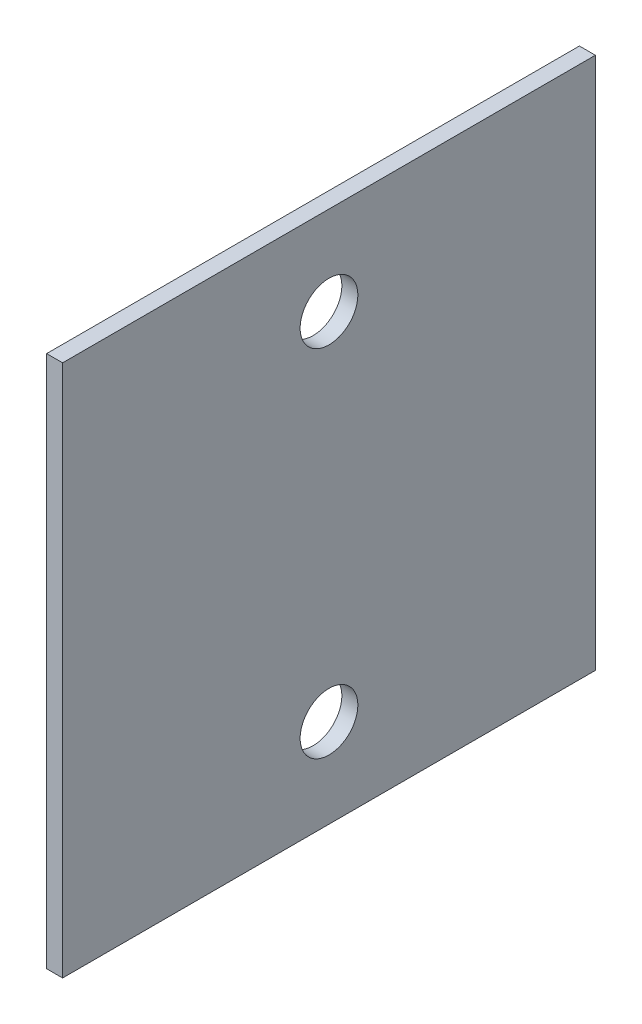
ISO-10303-21;
HEADER;
FILE_DESCRIPTION(('STEP AP214'),'2;1');
FILE_NAME('part.step','',(''),(''),'','','');
FILE_SCHEMA(('AUTOMOTIVE_DESIGN { 1 0 10303 214 1 1 1 1 }'));
ENDSEC;
DATA;
#1=APPLICATION_CONTEXT('core data for automotive mechanical design processes');
#2=APPLICATION_PROTOCOL_DEFINITION('international standard','automotive_design',2000,#1);
#3=PRODUCT_CONTEXT('',#1,'mechanical');
#4=PRODUCT('Part','Part','',(#3));
#5=PRODUCT_RELATED_PRODUCT_CATEGORY('part','',(#4));
#6=PRODUCT_DEFINITION_FORMATION('','',#4);
#7=PRODUCT_DEFINITION_CONTEXT('part definition',#1,'design');
#8=PRODUCT_DEFINITION('design','',#6,#7);
#9=PRODUCT_DEFINITION_SHAPE('','',#8);
#10=(LENGTH_UNIT() NAMED_UNIT(*) SI_UNIT(.MILLI.,.METRE.));
#11=(NAMED_UNIT(*) PLANE_ANGLE_UNIT() SI_UNIT($,.RADIAN.));
#12=(NAMED_UNIT(*) SI_UNIT($,.STERADIAN.) SOLID_ANGLE_UNIT());
#13=UNCERTAINTY_MEASURE_WITH_UNIT(LENGTH_MEASURE(1.E-05),#10,'distance_accuracy_value','');
#14=(GEOMETRIC_REPRESENTATION_CONTEXT(3) GLOBAL_UNCERTAINTY_ASSIGNED_CONTEXT((#13)) GLOBAL_UNIT_ASSIGNED_CONTEXT((#10,
#11,#12)) REPRESENTATION_CONTEXT('',''));
#15=CARTESIAN_POINT('',(0.,0.,0.));
#16=DIRECTION('',(0.,0.,1.));
#17=DIRECTION('',(1.,0.,0.));
#18=AXIS2_PLACEMENT_3D('',#15,#16,#17);
#19=CARTESIAN_POINT('',(1.8,-30.,0.));
#20=DIRECTION('',(0.,0.,1.));
#21=DIRECTION('',(0.,-1.,0.));
#22=AXIS2_PLACEMENT_3D('',#19,#20,#21);
#23=PLANE('',#22);
#24=DIRECTION('',(0.,1.,0.));
#25=VECTOR('',#24,1.);
#26=CARTESIAN_POINT('',(0.,-30.,0.));
#27=LINE('',#26,#25);
#28=CARTESIAN_POINT('',(0.,-30.,0.));
#29=VERTEX_POINT('',#28);
#30=CARTESIAN_POINT('',(0.,30.,0.));
#31=VERTEX_POINT('',#30);
#32=EDGE_CURVE('E95',#29,#31,#27,.T.);
#33=ORIENTED_EDGE('',*,*,#32,.T.);
#34=DIRECTION('',(-1.,0.,0.));
#35=VECTOR('',#34,1.);
#36=CARTESIAN_POINT('',(1.8,30.,0.));
#37=LINE('',#36,#35);
#38=CARTESIAN_POINT('',(1.8,30.,0.));
#39=VERTEX_POINT('',#38);
#40=EDGE_CURVE('E11',#39,#31,#37,.T.);
#41=ORIENTED_EDGE('',*,*,#40,.F.);
#42=DIRECTION('',(0.,1.,0.));
#43=VECTOR('',#42,1.);
#44=CARTESIAN_POINT('',(1.8,-30.,0.));
#45=LINE('',#44,#43);
#46=CARTESIAN_POINT('',(1.8,-30.,0.));
#47=VERTEX_POINT('',#46);
#48=EDGE_CURVE('E83',#47,#39,#45,.T.);
#49=ORIENTED_EDGE('',*,*,#48,.F.);
#50=DIRECTION('',(-1.,0.,0.));
#51=VECTOR('',#50,1.);
#52=CARTESIAN_POINT('',(1.8,-30.,0.));
#53=LINE('',#52,#51);
#54=EDGE_CURVE('E91',#47,#29,#53,.T.);
#55=ORIENTED_EDGE('',*,*,#54,.T.);
#56=EDGE_LOOP('',(#33,#41,#49,#55));
#57=FACE_BOUND('',#56,.T.);
#58=ADVANCED_FACE('F32',(#57),#23,.F.);
#59=CARTESIAN_POINT('',(1.8,30.,0.));
#60=DIRECTION('',(0.,-1.,0.));
#61=DIRECTION('',(0.,0.,-1.));
#62=AXIS2_PLACEMENT_3D('',#59,#60,#61);
#63=PLANE('',#62);
#64=DIRECTION('',(0.,0.,1.));
#65=VECTOR('',#64,1.);
#66=CARTESIAN_POINT('',(0.,30.,0.));
#67=LINE('',#66,#65);
#68=CARTESIAN_POINT('',(0.,30.,60.));
#69=VERTEX_POINT('',#68);
#70=EDGE_CURVE('E87',#31,#69,#67,.T.);
#71=ORIENTED_EDGE('',*,*,#70,.T.);
#72=DIRECTION('',(-1.,0.,0.));
#73=VECTOR('',#72,1.);
#74=CARTESIAN_POINT('',(1.8,30.,60.));
#75=LINE('',#74,#73);
#76=CARTESIAN_POINT('',(1.8,30.,60.));
#77=VERTEX_POINT('',#76);
#78=EDGE_CURVE('E40',#77,#69,#75,.T.);
#79=ORIENTED_EDGE('',*,*,#78,.F.);
#80=DIRECTION('',(0.,0.,1.));
#81=VECTOR('',#80,1.);
#82=CARTESIAN_POINT('',(1.8,30.,0.));
#83=LINE('',#82,#81);
#84=EDGE_CURVE('E78',#39,#77,#83,.T.);
#85=ORIENTED_EDGE('',*,*,#84,.F.);
#86=ORIENTED_EDGE('',*,*,#40,.T.);
#87=EDGE_LOOP('',(#71,#79,#85,#86));
#88=FACE_BOUND('',#87,.T.);
#89=ADVANCED_FACE('F86',(#88),#63,.F.);
#90=CARTESIAN_POINT('',(1.8,-30.,60.));
#91=DIRECTION('',(0.,0.,-1.));
#92=DIRECTION('',(0.,1.,0.));
#93=AXIS2_PLACEMENT_3D('',#90,#91,#92);
#94=PLANE('',#93);
#95=DIRECTION('',(0.,-1.,0.));
#96=VECTOR('',#95,1.);
#97=CARTESIAN_POINT('',(0.,-30.,60.));
#98=LINE('',#97,#96);
#99=CARTESIAN_POINT('',(0.,-30.,60.));
#100=VERTEX_POINT('',#99);
#101=EDGE_CURVE('E65',#69,#100,#98,.T.);
#102=ORIENTED_EDGE('',*,*,#101,.T.);
#103=DIRECTION('',(-1.,0.,0.));
#104=VECTOR('',#103,1.);
#105=CARTESIAN_POINT('',(1.8,-30.,60.));
#106=LINE('',#105,#104);
#107=CARTESIAN_POINT('',(1.8,-30.,60.));
#108=VERTEX_POINT('',#107);
#109=EDGE_CURVE('E88',#108,#100,#106,.T.);
#110=ORIENTED_EDGE('',*,*,#109,.F.);
#111=DIRECTION('',(0.,-1.,0.));
#112=VECTOR('',#111,1.);
#113=CARTESIAN_POINT('',(1.8,-30.,60.));
#114=LINE('',#113,#112);
#115=EDGE_CURVE('E81',#77,#108,#114,.T.);
#116=ORIENTED_EDGE('',*,*,#115,.F.);
#117=ORIENTED_EDGE('',*,*,#78,.T.);
#118=EDGE_LOOP('',(#102,#110,#116,#117));
#119=FACE_BOUND('',#118,.T.);
#120=ADVANCED_FACE('F89',(#119),#94,.F.);
#121=CARTESIAN_POINT('',(1.8,-30.,0.));
#122=DIRECTION('',(0.,1.,0.));
#123=DIRECTION('',(0.,0.,1.));
#124=AXIS2_PLACEMENT_3D('',#121,#122,#123);
#125=PLANE('',#124);
#126=DIRECTION('',(0.,0.,-1.));
#127=VECTOR('',#126,1.);
#128=CARTESIAN_POINT('',(0.,-30.,0.));
#129=LINE('',#128,#127);
#130=EDGE_CURVE('E71',#100,#29,#129,.T.);
#131=ORIENTED_EDGE('',*,*,#130,.T.);
#132=ORIENTED_EDGE('',*,*,#54,.F.);
#133=DIRECTION('',(0.,0.,-1.));
#134=VECTOR('',#133,1.);
#135=CARTESIAN_POINT('',(1.8,-30.,0.));
#136=LINE('',#135,#134);
#137=EDGE_CURVE('E48',#108,#47,#136,.T.);
#138=ORIENTED_EDGE('',*,*,#137,.F.);
#139=ORIENTED_EDGE('',*,*,#109,.T.);
#140=EDGE_LOOP('',(#131,#132,#138,#139));
#141=FACE_BOUND('',#140,.T.);
#142=ADVANCED_FACE('F103',(#141),#125,.F.);
#143=CARTESIAN_POINT('',(1.8,30.,0.));
#144=DIRECTION('',(1.,0.,0.));
#145=DIRECTION('',(0.,0.,-1.));
#146=AXIS2_PLACEMENT_3D('',#143,#144,#145);
#147=PLANE('',#146);
#148=CARTESIAN_POINT('',(1.8,-20.,30.));
#149=DIRECTION('',(1.,0.,0.));
#150=DIRECTION('',(0.,0.,-1.));
#151=AXIS2_PLACEMENT_3D('',#148,#149,#150);
#152=CIRCLE('',#151,3.24999999999999);
#153=CARTESIAN_POINT('',(1.8,-20.,26.75));
#154=VERTEX_POINT('',#153);
#155=EDGE_CURVE('E117',#154,#154,#152,.T.);
#156=ORIENTED_EDGE('',*,*,#155,.F.);
#157=EDGE_LOOP('',(#156));
#158=FACE_BOUND('',#157,.T.);
#159=CARTESIAN_POINT('',(1.8,20.,30.));
#160=DIRECTION('',(1.,0.,0.));
#161=DIRECTION('',(0.,0.,-1.));
#162=AXIS2_PLACEMENT_3D('',#159,#160,#161);
#163=CIRCLE('',#162,3.24999999999999);
#164=CARTESIAN_POINT('',(1.8,20.,26.75));
#165=VERTEX_POINT('',#164);
#166=EDGE_CURVE('E111',#165,#165,#163,.T.);
#167=ORIENTED_EDGE('',*,*,#166,.F.);
#168=EDGE_LOOP('',(#167));
#169=FACE_BOUND('',#168,.T.);
#170=ORIENTED_EDGE('',*,*,#48,.T.);
#171=ORIENTED_EDGE('',*,*,#84,.T.);
#172=ORIENTED_EDGE('',*,*,#115,.T.);
#173=ORIENTED_EDGE('',*,*,#137,.T.);
#174=EDGE_LOOP('',(#170,#171,#172,#173));
#175=FACE_BOUND('',#174,.T.);
#176=ADVANCED_FACE('F79',(#158,#169,#175),#147,.T.);
#177=CARTESIAN_POINT('',(0.,30.,0.));
#178=DIRECTION('',(1.,0.,0.));
#179=DIRECTION('',(0.,0.,-1.));
#180=AXIS2_PLACEMENT_3D('',#177,#178,#179);
#181=PLANE('',#180);
#182=CARTESIAN_POINT('',(0.,-20.,30.));
#183=DIRECTION('',(1.,0.,0.));
#184=DIRECTION('',(0.,0.,-1.));
#185=AXIS2_PLACEMENT_3D('',#182,#183,#184);
#186=CIRCLE('',#185,3.25);
#187=CARTESIAN_POINT('',(0.,-20.,26.75));
#188=VERTEX_POINT('',#187);
#189=EDGE_CURVE('E114',#188,#188,#186,.T.);
#190=ORIENTED_EDGE('',*,*,#189,.T.);
#191=EDGE_LOOP('',(#190));
#192=FACE_BOUND('',#191,.T.);
#193=CARTESIAN_POINT('',(0.,20.,30.));
#194=DIRECTION('',(1.,0.,0.));
#195=DIRECTION('',(0.,0.,-1.));
#196=AXIS2_PLACEMENT_3D('',#193,#194,#195);
#197=CIRCLE('',#196,3.25);
#198=CARTESIAN_POINT('',(0.,20.,26.75));
#199=VERTEX_POINT('',#198);
#200=EDGE_CURVE('E98',#199,#199,#197,.T.);
#201=ORIENTED_EDGE('',*,*,#200,.T.);
#202=EDGE_LOOP('',(#201));
#203=FACE_BOUND('',#202,.T.);
#204=ORIENTED_EDGE('',*,*,#32,.F.);
#205=ORIENTED_EDGE('',*,*,#130,.F.);
#206=ORIENTED_EDGE('',*,*,#101,.F.);
#207=ORIENTED_EDGE('',*,*,#70,.F.);
#208=EDGE_LOOP('',(#204,#205,#206,#207));
#209=FACE_BOUND('',#208,.T.);
#210=ADVANCED_FACE('F106',(#192,#203,#209),#181,.F.);
#211=CARTESIAN_POINT('',(1.8,20.,30.));
#212=DIRECTION('',(1.,0.,0.));
#213=DIRECTION('',(0.,0.,-1.));
#214=AXIS2_PLACEMENT_3D('',#211,#212,#213);
#215=CYLINDRICAL_SURFACE('',#214,3.24999999999999);
#216=ORIENTED_EDGE('',*,*,#200,.F.);
#217=EDGE_LOOP('',(#216));
#218=FACE_BOUND('',#217,.T.);
#219=ORIENTED_EDGE('',*,*,#166,.T.);
#220=EDGE_LOOP('',(#219));
#221=FACE_BOUND('',#220,.T.);
#222=ADVANCED_FACE('F128',(#218,#221),#215,.F.);
#223=CARTESIAN_POINT('',(1.8,-20.,30.));
#224=DIRECTION('',(1.,0.,0.));
#225=DIRECTION('',(0.,0.,-1.));
#226=AXIS2_PLACEMENT_3D('',#223,#224,#225);
#227=CYLINDRICAL_SURFACE('',#226,3.24999999999999);
#228=ORIENTED_EDGE('',*,*,#189,.F.);
#229=EDGE_LOOP('',(#228));
#230=FACE_BOUND('',#229,.T.);
#231=ORIENTED_EDGE('',*,*,#155,.T.);
#232=EDGE_LOOP('',(#231));
#233=FACE_BOUND('',#232,.T.);
#234=ADVANCED_FACE('F121',(#230,#233),#227,.F.);
#235=CLOSED_SHELL('',(#58,#89,#120,#142,#176,#210,#222,#234));
#236=MANIFOLD_SOLID_BREP('B2',#235);
#237=ADVANCED_BREP_SHAPE_REPRESENTATION('',(#18,#236),#14);
#238=SHAPE_DEFINITION_REPRESENTATION(#9,#237);
ENDSEC;
END-ISO-10303-21;
